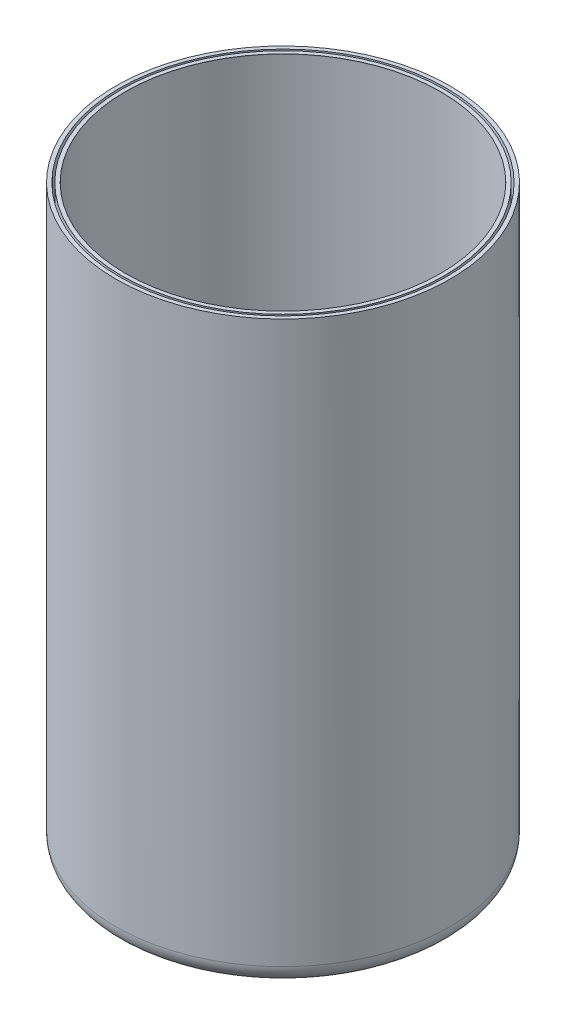
ISO-10303-21;
HEADER;
FILE_DESCRIPTION(('STEP AP214'),'2;1');
FILE_NAME('part.step','',(''),(''),'','','');
FILE_SCHEMA(('AUTOMOTIVE_DESIGN { 1 0 10303 214 1 1 1 1 }'));
ENDSEC;
DATA;
#1=APPLICATION_CONTEXT('core data for automotive mechanical design processes');
#2=APPLICATION_PROTOCOL_DEFINITION('international standard','automotive_design',2000,#1);
#3=PRODUCT_CONTEXT('',#1,'mechanical');
#4=PRODUCT('Part','Part','',(#3));
#5=PRODUCT_RELATED_PRODUCT_CATEGORY('part','',(#4));
#6=PRODUCT_DEFINITION_FORMATION('','',#4);
#7=PRODUCT_DEFINITION_CONTEXT('part definition',#1,'design');
#8=PRODUCT_DEFINITION('design','',#6,#7);
#9=PRODUCT_DEFINITION_SHAPE('','',#8);
#10=(LENGTH_UNIT() NAMED_UNIT(*) SI_UNIT(.MILLI.,.METRE.));
#11=(NAMED_UNIT(*) PLANE_ANGLE_UNIT() SI_UNIT($,.RADIAN.));
#12=(NAMED_UNIT(*) SI_UNIT($,.STERADIAN.) SOLID_ANGLE_UNIT());
#13=UNCERTAINTY_MEASURE_WITH_UNIT(LENGTH_MEASURE(1.E-05),#10,'distance_accuracy_value','');
#14=(GEOMETRIC_REPRESENTATION_CONTEXT(3) GLOBAL_UNCERTAINTY_ASSIGNED_CONTEXT((#13)) GLOBAL_UNIT_ASSIGNED_CONTEXT((#10,
#11,#12)) REPRESENTATION_CONTEXT('',''));
#15=CARTESIAN_POINT('',(0.,0.,0.));
#16=DIRECTION('',(0.,0.,1.));
#17=DIRECTION('',(1.,0.,0.));
#18=AXIS2_PLACEMENT_3D('',#15,#16,#17);
#19=CARTESIAN_POINT('',(92.315128883838,-643.833737410939,-0.555450246738897));
#20=DIRECTION('',(0.,1.,0.));
#21=DIRECTION('',(0.,0.,1.));
#22=AXIS2_PLACEMENT_3D('',#19,#20,#21);
#23=PLANE('',#22);
#24=CARTESIAN_POINT('',(1.16512888383796,-643.833737410939,-0.555450246738897));
#25=DIRECTION('',(0.,1.,0.));
#26=DIRECTION('',(0.,0.,1.));
#27=AXIS2_PLACEMENT_3D('',#24,#25,#26);
#28=CIRCLE('',#27,87.3);
#29=CARTESIAN_POINT('',(1.16512888383796,-643.833737410939,86.7445497532612));
#30=VERTEX_POINT('',#29);
#31=EDGE_CURVE('E340',#30,#30,#28,.F.);
#32=ORIENTED_EDGE('',*,*,#31,.F.);
#33=EDGE_LOOP('',(#32));
#34=FACE_BOUND('',#33,.T.);
#35=CARTESIAN_POINT('',(1.16512888383796,-643.833737410939,-0.555450246738897));
#36=DIRECTION('',(0.,-1.,0.));
#37=DIRECTION('',(0.,0.,-1.));
#38=AXIS2_PLACEMENT_3D('',#35,#36,#37);
#39=CIRCLE('',#38,91.15);
#40=CARTESIAN_POINT('',(1.16512888383796,-643.833737410939,-91.7054502467389));
#41=VERTEX_POINT('',#40);
#42=EDGE_CURVE('E337',#41,#41,#39,.T.);
#43=ORIENTED_EDGE('',*,*,#42,.T.);
#44=EDGE_LOOP('',(#43));
#45=FACE_BOUND('',#44,.T.);
#46=ADVANCED_FACE('F300',(#34,#45),#23,.F.);
#47=CARTESIAN_POINT('',(1.16512888383796,-628.833737410939,-0.555450246738897));
#48=DIRECTION('',(0.,-1.,0.));
#49=DIRECTION('',(0.,0.,-1.));
#50=AXIS2_PLACEMENT_3D('',#47,#48,#49);
#51=TOROIDAL_SURFACE('',#50,91.15,15.);
#52=ORIENTED_EDGE('',*,*,#42,.F.);
#53=EDGE_LOOP('',(#52));
#54=FACE_BOUND('',#53,.T.);
#55=CARTESIAN_POINT('',(1.16512888383796,-628.833737410939,-0.555450246738897));
#56=DIRECTION('',(0.,-1.,0.));
#57=DIRECTION('',(0.,0.,-1.));
#58=AXIS2_PLACEMENT_3D('',#55,#56,#57);
#59=CIRCLE('',#58,106.15);
#60=CARTESIAN_POINT('',(1.16512888383796,-628.833737410939,-106.705450246739));
#61=VERTEX_POINT('',#60);
#62=EDGE_CURVE('E333',#61,#61,#59,.T.);
#63=ORIENTED_EDGE('',*,*,#62,.T.);
#64=EDGE_LOOP('',(#63));
#65=FACE_BOUND('',#64,.T.);
#66=ADVANCED_FACE('F378',(#54,#65),#51,.T.);
#67=CARTESIAN_POINT('',(1.16512888383796,-260.333737410939,-0.555450246738897));
#68=DIRECTION('',(0.,-1.,0.));
#69=DIRECTION('',(0.,0.,-1.));
#70=AXIS2_PLACEMENT_3D('',#67,#68,#69);
#71=CYLINDRICAL_SURFACE('',#70,106.15);
#72=ORIENTED_EDGE('',*,*,#62,.F.);
#73=EDGE_LOOP('',(#72));
#74=FACE_BOUND('',#73,.T.);
#75=CARTESIAN_POINT('',(1.16512888383796,-272.833737410939,-0.555450246738897));
#76=DIRECTION('',(0.,-1.,0.));
#77=DIRECTION('',(0.,0.,-1.));
#78=AXIS2_PLACEMENT_3D('',#75,#76,#77);
#79=CIRCLE('',#78,106.15);
#80=CARTESIAN_POINT('',(1.16512888383796,-272.833737410939,-106.705450246739));
#81=VERTEX_POINT('',#80);
#82=EDGE_CURVE('E330',#81,#81,#79,.T.);
#83=ORIENTED_EDGE('',*,*,#82,.T.);
#84=EDGE_LOOP('',(#83));
#85=FACE_BOUND('',#84,.T.);
#86=ADVANCED_FACE('F368',(#74,#85),#71,.T.);
#87=CARTESIAN_POINT('',(1.16512888383796,-272.833737410939,-0.555450246738897));
#88=DIRECTION('',(0.,-1.,0.));
#89=DIRECTION('',(0.,0.,-1.));
#90=AXIS2_PLACEMENT_3D('',#87,#88,#89);
#91=TOROIDAL_SURFACE('',#90,91.15,15.);
#92=ORIENTED_EDGE('',*,*,#82,.F.);
#93=EDGE_LOOP('',(#92));
#94=FACE_BOUND('',#93,.T.);
#95=CARTESIAN_POINT('',(1.16512888383796,-272.633737410939,-0.555450246738897));
#96=DIRECTION('',(0.,1.,0.));
#97=DIRECTION('',(0.,0.,1.));
#98=AXIS2_PLACEMENT_3D('',#95,#96,#97);
#99=CIRCLE('',#98,106.148666607402);
#100=CARTESIAN_POINT('',(1.16512888383796,-272.633737410939,105.593216360663));
#101=VERTEX_POINT('',#100);
#102=EDGE_CURVE('E304',#101,#101,#99,.T.);
#103=ORIENTED_EDGE('',*,*,#102,.F.);
#104=EDGE_LOOP('',(#103));
#105=FACE_BOUND('',#104,.T.);
#106=ADVANCED_FACE('F365',(#94,#105),#91,.T.);
#107=CARTESIAN_POINT('',(1.16512888383796,-260.333737410939,-0.555450246738897));
#108=DIRECTION('',(0.,-1.,0.));
#109=DIRECTION('',(0.,0.,-1.));
#110=AXIS2_PLACEMENT_3D('',#107,#108,#109);
#111=CYLINDRICAL_SURFACE('',#110,87.3);
#112=CARTESIAN_POINT('',(1.16512888383796,-651.533737410939,-0.555450246738897));
#113=DIRECTION('',(0.,-1.,0.));
#114=DIRECTION('',(0.,0.,-1.));
#115=AXIS2_PLACEMENT_3D('',#112,#113,#114);
#116=CIRCLE('',#115,87.3);
#117=CARTESIAN_POINT('',(1.16512888383796,-651.533737410939,-87.8554502467389));
#118=VERTEX_POINT('',#117);
#119=EDGE_CURVE('E343',#118,#118,#116,.T.);
#120=ORIENTED_EDGE('',*,*,#119,.F.);
#121=EDGE_LOOP('',(#120));
#122=FACE_BOUND('',#121,.T.);
#123=ORIENTED_EDGE('',*,*,#31,.T.);
#124=EDGE_LOOP('',(#123));
#125=FACE_BOUND('',#124,.T.);
#126=ADVANCED_FACE('F367',(#122,#125),#111,.T.);
#127=CARTESIAN_POINT('',(85.965128883838,-651.533737410939,-0.555450246738897));
#128=DIRECTION('',(0.,-1.,0.));
#129=DIRECTION('',(0.,0.,-1.));
#130=AXIS2_PLACEMENT_3D('',#127,#128,#129);
#131=PLANE('',#130);
#132=CARTESIAN_POINT('',(1.16512888383796,-651.533737410939,-0.555450246738897));
#133=DIRECTION('',(0.,-1.,0.));
#134=DIRECTION('',(0.,0.,-1.));
#135=AXIS2_PLACEMENT_3D('',#132,#133,#134);
#136=CIRCLE('',#135,97.5);
#137=CARTESIAN_POINT('',(1.16512888383796,-651.533737410939,-98.0554502467389));
#138=VERTEX_POINT('',#137);
#139=EDGE_CURVE('E346',#138,#138,#136,.T.);
#140=ORIENTED_EDGE('',*,*,#139,.F.);
#141=EDGE_LOOP('',(#140));
#142=FACE_BOUND('',#141,.T.);
#143=ORIENTED_EDGE('',*,*,#119,.T.);
#144=EDGE_LOOP('',(#143));
#145=FACE_BOUND('',#144,.T.);
#146=ADVANCED_FACE('F375',(#142,#145),#131,.F.);
#147=CARTESIAN_POINT('',(1.16512888383796,-641.533737410939,-0.555450246738897));
#148=DIRECTION('',(0.,-1.,0.));
#149=DIRECTION('',(0.,0.,-1.));
#150=AXIS2_PLACEMENT_3D('',#147,#148,#149);
#151=TOROIDAL_SURFACE('',#150,97.5,9.99999999999998);
#152=CARTESIAN_POINT('',(1.16512888383796,-641.533737410939,-0.555450246738897));
#153=DIRECTION('',(0.,-1.,0.));
#154=DIRECTION('',(0.,0.,-1.));
#155=AXIS2_PLACEMENT_3D('',#152,#153,#154);
#156=CIRCLE('',#155,107.5);
#157=CARTESIAN_POINT('',(1.16512888383796,-641.533737410939,-108.055450246739));
#158=VERTEX_POINT('',#157);
#159=EDGE_CURVE('E329',#158,#158,#156,.T.);
#160=ORIENTED_EDGE('',*,*,#159,.F.);
#161=EDGE_LOOP('',(#160));
#162=FACE_BOUND('',#161,.T.);
#163=ORIENTED_EDGE('',*,*,#139,.T.);
#164=EDGE_LOOP('',(#163));
#165=FACE_BOUND('',#164,.T.);
#166=ADVANCED_FACE('F396',(#162,#165),#151,.F.);
#167=CARTESIAN_POINT('',(1.16512888383796,-260.333737410939,-0.555450246738897));
#168=DIRECTION('',(0.,-1.,0.));
#169=DIRECTION('',(0.,0.,-1.));
#170=AXIS2_PLACEMENT_3D('',#167,#168,#169);
#171=CYLINDRICAL_SURFACE('',#170,107.5);
#172=ORIENTED_EDGE('',*,*,#159,.T.);
#173=EDGE_LOOP('',(#172));
#174=FACE_BOUND('',#173,.T.);
#175=CARTESIAN_POINT('',(1.16512888383796,-272.633737410939,-0.555450246738897));
#176=DIRECTION('',(0.,1.,0.));
#177=DIRECTION('',(0.,0.,1.));
#178=AXIS2_PLACEMENT_3D('',#175,#176,#177);
#179=CIRCLE('',#178,107.5);
#180=CARTESIAN_POINT('',(1.16512888383796,-272.633737410939,106.944549753261));
#181=VERTEX_POINT('',#180);
#182=EDGE_CURVE('E356',#181,#181,#179,.F.);
#183=ORIENTED_EDGE('',*,*,#182,.F.);
#184=EDGE_LOOP('',(#183));
#185=FACE_BOUND('',#184,.T.);
#186=ADVANCED_FACE('F400',(#174,#185),#171,.F.);
#187=CARTESIAN_POINT('',(1.16512888383796,-272.633737410939,-0.555450246738897));
#188=DIRECTION('',(0.,1.,0.));
#189=DIRECTION('',(0.,0.,1.));
#190=AXIS2_PLACEMENT_3D('',#187,#188,#189);
#191=PLANE('',#190);
#192=CARTESIAN_POINT('',(1.16512888383796,-272.633737410939,-0.555450246738897));
#193=DIRECTION('',(0.,1.,0.));
#194=DIRECTION('',(0.,0.,1.));
#195=AXIS2_PLACEMENT_3D('',#192,#193,#194);
#196=CIRCLE('',#195,103.648399897587);
#197=CARTESIAN_POINT('',(1.16512888383796,-272.633737410939,103.092949650848));
#198=VERTEX_POINT('',#197);
#199=EDGE_CURVE('E353',#198,#198,#196,.T.);
#200=ORIENTED_EDGE('',*,*,#199,.F.);
#201=EDGE_LOOP('',(#200));
#202=FACE_BOUND('',#201,.T.);
#203=ORIENTED_EDGE('',*,*,#102,.T.);
#204=EDGE_LOOP('',(#203));
#205=FACE_BOUND('',#204,.T.);
#206=ADVANCED_FACE('F363',(#202,#205),#191,.T.);
#207=CARTESIAN_POINT('',(1.16512888383796,-272.633737410939,-0.555450246738897));
#208=DIRECTION('',(0.,1.,0.));
#209=DIRECTION('',(0.,0.,1.));
#210=AXIS2_PLACEMENT_3D('',#207,#208,#209);
#211=CIRCLE('',#210,110.);
#212=CARTESIAN_POINT('',(1.16512888383796,-272.633737410939,109.444549753261));
#213=VERTEX_POINT('',#212);
#214=EDGE_CURVE('E334',#213,#213,#211,.F.);
#215=ORIENTED_EDGE('',*,*,#214,.F.);
#216=EDGE_LOOP('',(#215));
#217=FACE_BOUND('',#216,.T.);
#218=ORIENTED_EDGE('',*,*,#182,.T.);
#219=EDGE_LOOP('',(#218));
#220=FACE_BOUND('',#219,.T.);
#221=ADVANCED_FACE('F405',(#217,#220),#191,.T.);
#222=CARTESIAN_POINT('',(1.16512888383796,-260.333737410939,-0.555450246738897));
#223=DIRECTION('',(0.,-1.,0.));
#224=DIRECTION('',(0.,0.,-1.));
#225=AXIS2_PLACEMENT_3D('',#222,#223,#224);
#226=CYLINDRICAL_SURFACE('',#225,110.);
#227=CARTESIAN_POINT('',(1.16512888383796,-641.533737410939,-0.555450246738897));
#228=DIRECTION('',(0.,-1.,0.));
#229=DIRECTION('',(0.,0.,-1.));
#230=AXIS2_PLACEMENT_3D('',#227,#228,#229);
#231=CIRCLE('',#230,110.);
#232=CARTESIAN_POINT('',(1.16512888383796,-641.533737410939,-110.555450246739));
#233=VERTEX_POINT('',#232);
#234=EDGE_CURVE('E11',#233,#233,#231,.T.);
#235=ORIENTED_EDGE('',*,*,#234,.F.);
#236=EDGE_LOOP('',(#235));
#237=FACE_BOUND('',#236,.T.);
#238=ORIENTED_EDGE('',*,*,#214,.T.);
#239=EDGE_LOOP('',(#238));
#240=FACE_BOUND('',#239,.T.);
#241=ADVANCED_FACE('F302',(#237,#240),#226,.T.);
#242=CARTESIAN_POINT('',(1.16512888383796,-272.833737410939,-0.555450246738897));
#243=DIRECTION('',(0.,-1.,0.));
#244=DIRECTION('',(0.,0.,-1.));
#245=AXIS2_PLACEMENT_3D('',#242,#243,#244);
#246=TOROIDAL_SURFACE('',#245,91.15,12.5);
#247=CARTESIAN_POINT('',(1.16512888383796,-272.833737410939,-0.555450246738897));
#248=DIRECTION('',(0.,-1.,0.));
#249=DIRECTION('',(0.,0.,-1.));
#250=AXIS2_PLACEMENT_3D('',#247,#248,#249);
#251=CIRCLE('',#250,103.65);
#252=CARTESIAN_POINT('',(1.16512888383796,-272.833737410939,-104.205450246739));
#253=VERTEX_POINT('',#252);
#254=EDGE_CURVE('E326',#253,#253,#251,.T.);
#255=ORIENTED_EDGE('',*,*,#254,.T.);
#256=EDGE_LOOP('',(#255));
#257=FACE_BOUND('',#256,.T.);
#258=ORIENTED_EDGE('',*,*,#199,.T.);
#259=EDGE_LOOP('',(#258));
#260=FACE_BOUND('',#259,.T.);
#261=ADVANCED_FACE('F412',(#257,#260),#246,.F.);
#262=CARTESIAN_POINT('',(1.16512888383796,-641.533737410939,-0.555450246738897));
#263=DIRECTION('',(0.,-1.,0.));
#264=DIRECTION('',(0.,0.,-1.));
#265=AXIS2_PLACEMENT_3D('',#262,#263,#264);
#266=TOROIDAL_SURFACE('',#265,97.5,12.5);
#267=ORIENTED_EDGE('',*,*,#234,.T.);
#268=EDGE_LOOP('',(#267));
#269=FACE_BOUND('',#268,.T.);
#270=CARTESIAN_POINT('',(1.16512888383796,-654.033737410939,-0.555450246738897));
#271=DIRECTION('',(0.,-1.,0.));
#272=DIRECTION('',(0.,0.,-1.));
#273=AXIS2_PLACEMENT_3D('',#270,#271,#272);
#274=CIRCLE('',#273,97.5);
#275=CARTESIAN_POINT('',(1.16512888383796,-654.033737410939,-98.0554502467389));
#276=VERTEX_POINT('',#275);
#277=EDGE_CURVE('E308',#276,#276,#274,.T.);
#278=ORIENTED_EDGE('',*,*,#277,.F.);
#279=EDGE_LOOP('',(#278));
#280=FACE_BOUND('',#279,.T.);
#281=ADVANCED_FACE('F422',(#269,#280),#266,.T.);
#282=CARTESIAN_POINT('',(85.965128883838,-654.033737410939,-0.555450246738897));
#283=DIRECTION('',(0.,-1.,0.));
#284=DIRECTION('',(0.,0.,-1.));
#285=AXIS2_PLACEMENT_3D('',#282,#283,#284);
#286=PLANE('',#285);
#287=ORIENTED_EDGE('',*,*,#277,.T.);
#288=EDGE_LOOP('',(#287));
#289=FACE_BOUND('',#288,.T.);
#290=CARTESIAN_POINT('',(1.16512888383796,-654.033737410939,-0.555450246738897));
#291=DIRECTION('',(0.,-1.,0.));
#292=DIRECTION('',(0.,0.,-1.));
#293=AXIS2_PLACEMENT_3D('',#290,#291,#292);
#294=CIRCLE('',#293,84.8);
#295=CARTESIAN_POINT('',(1.16512888383796,-654.033737410939,-85.3554502467389));
#296=VERTEX_POINT('',#295);
#297=EDGE_CURVE('E312',#296,#296,#294,.T.);
#298=ORIENTED_EDGE('',*,*,#297,.F.);
#299=EDGE_LOOP('',(#298));
#300=FACE_BOUND('',#299,.T.);
#301=ADVANCED_FACE('F427',(#289,#300),#286,.T.);
#302=CARTESIAN_POINT('',(1.16512888383796,-260.333737410939,-0.555450246738897));
#303=DIRECTION('',(0.,-1.,0.));
#304=DIRECTION('',(0.,0.,-1.));
#305=AXIS2_PLACEMENT_3D('',#302,#303,#304);
#306=CYLINDRICAL_SURFACE('',#305,84.8);
#307=ORIENTED_EDGE('',*,*,#297,.T.);
#308=EDGE_LOOP('',(#307));
#309=FACE_BOUND('',#308,.T.);
#310=CARTESIAN_POINT('',(1.16512888383796,-641.333737410939,-0.555450246738897));
#311=DIRECTION('',(0.,-1.,0.));
#312=DIRECTION('',(0.,0.,-1.));
#313=AXIS2_PLACEMENT_3D('',#310,#311,#312);
#314=CIRCLE('',#313,84.8);
#315=CARTESIAN_POINT('',(1.16512888383796,-641.333737410939,-85.3554502467389));
#316=VERTEX_POINT('',#315);
#317=EDGE_CURVE('E317',#316,#316,#314,.T.);
#318=ORIENTED_EDGE('',*,*,#317,.F.);
#319=EDGE_LOOP('',(#318));
#320=FACE_BOUND('',#319,.T.);
#321=ADVANCED_FACE('F440',(#309,#320),#306,.F.);
#322=CARTESIAN_POINT('',(92.315128883838,-641.333737410939,-0.555450246738897));
#323=DIRECTION('',(0.,1.,0.));
#324=DIRECTION('',(0.,0.,1.));
#325=AXIS2_PLACEMENT_3D('',#322,#323,#324);
#326=PLANE('',#325);
#327=ORIENTED_EDGE('',*,*,#317,.T.);
#328=EDGE_LOOP('',(#327));
#329=FACE_BOUND('',#328,.T.);
#330=CARTESIAN_POINT('',(1.16512888383796,-641.333737410939,-0.555450246738897));
#331=DIRECTION('',(0.,-1.,0.));
#332=DIRECTION('',(0.,0.,-1.));
#333=AXIS2_PLACEMENT_3D('',#330,#331,#332);
#334=CIRCLE('',#333,91.15);
#335=CARTESIAN_POINT('',(1.16512888383796,-641.333737410939,-91.7054502467389));
#336=VERTEX_POINT('',#335);
#337=EDGE_CURVE('E320',#336,#336,#334,.T.);
#338=ORIENTED_EDGE('',*,*,#337,.F.);
#339=EDGE_LOOP('',(#338));
#340=FACE_BOUND('',#339,.T.);
#341=ADVANCED_FACE('F436',(#329,#340),#326,.T.);
#342=CARTESIAN_POINT('',(1.16512888383796,-628.833737410939,-0.555450246738897));
#343=DIRECTION('',(0.,-1.,0.));
#344=DIRECTION('',(0.,0.,-1.));
#345=AXIS2_PLACEMENT_3D('',#342,#343,#344);
#346=TOROIDAL_SURFACE('',#345,91.15,12.5);
#347=ORIENTED_EDGE('',*,*,#337,.T.);
#348=EDGE_LOOP('',(#347));
#349=FACE_BOUND('',#348,.T.);
#350=CARTESIAN_POINT('',(1.16512888383796,-628.833737410939,-0.555450246738897));
#351=DIRECTION('',(0.,-1.,0.));
#352=DIRECTION('',(0.,0.,-1.));
#353=AXIS2_PLACEMENT_3D('',#350,#351,#352);
#354=CIRCLE('',#353,103.65);
#355=CARTESIAN_POINT('',(1.16512888383796,-628.833737410939,-104.205450246739));
#356=VERTEX_POINT('',#355);
#357=EDGE_CURVE('E323',#356,#356,#354,.T.);
#358=ORIENTED_EDGE('',*,*,#357,.F.);
#359=EDGE_LOOP('',(#358));
#360=FACE_BOUND('',#359,.T.);
#361=ADVANCED_FACE('F432',(#349,#360),#346,.F.);
#362=CARTESIAN_POINT('',(1.16512888383796,-260.333737410939,-0.555450246738897));
#363=DIRECTION('',(0.,-1.,0.));
#364=DIRECTION('',(0.,0.,-1.));
#365=AXIS2_PLACEMENT_3D('',#362,#363,#364);
#366=CYLINDRICAL_SURFACE('',#365,103.65);
#367=ORIENTED_EDGE('',*,*,#357,.T.);
#368=EDGE_LOOP('',(#367));
#369=FACE_BOUND('',#368,.T.);
#370=ORIENTED_EDGE('',*,*,#254,.F.);
#371=EDGE_LOOP('',(#370));
#372=FACE_BOUND('',#371,.T.);
#373=ADVANCED_FACE('F429',(#369,#372),#366,.F.);
#374=CLOSED_SHELL('',(#46,#66,#86,#106,#126,#146,#166,#186,#206,#221,#241,#261,#281,#301,#321,
#341,#361,#373));
#375=MANIFOLD_SOLID_BREP('B2',#374);
#376=ADVANCED_BREP_SHAPE_REPRESENTATION('',(#18,#375),#14);
#377=SHAPE_DEFINITION_REPRESENTATION(#9,#376);
ENDSEC;
END-ISO-10303-21;
